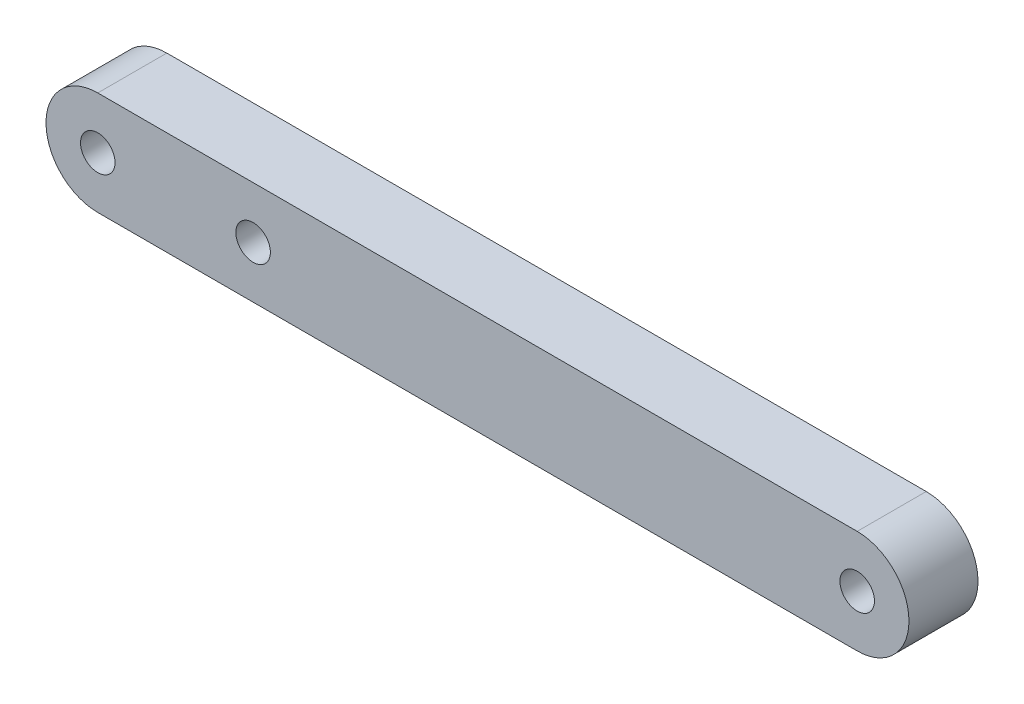
ISO-10303-21;
HEADER;
FILE_DESCRIPTION(('STEP AP214'),'2;1');
FILE_NAME('part.step','',(''),(''),'','','');
FILE_SCHEMA(('AUTOMOTIVE_DESIGN { 1 0 10303 214 1 1 1 1 }'));
ENDSEC;
DATA;
#1=APPLICATION_CONTEXT('core data for automotive mechanical design processes');
#2=APPLICATION_PROTOCOL_DEFINITION('international standard','automotive_design',2000,#1);
#3=PRODUCT_CONTEXT('',#1,'mechanical');
#4=PRODUCT('Part','Part','',(#3));
#5=PRODUCT_RELATED_PRODUCT_CATEGORY('part','',(#4));
#6=PRODUCT_DEFINITION_FORMATION('','',#4);
#7=PRODUCT_DEFINITION_CONTEXT('part definition',#1,'design');
#8=PRODUCT_DEFINITION('design','',#6,#7);
#9=PRODUCT_DEFINITION_SHAPE('','',#8);
#10=(LENGTH_UNIT() NAMED_UNIT(*) SI_UNIT(.MILLI.,.METRE.));
#11=(NAMED_UNIT(*) PLANE_ANGLE_UNIT() SI_UNIT($,.RADIAN.));
#12=(NAMED_UNIT(*) SI_UNIT($,.STERADIAN.) SOLID_ANGLE_UNIT());
#13=UNCERTAINTY_MEASURE_WITH_UNIT(LENGTH_MEASURE(1.E-05),#10,'distance_accuracy_value','');
#14=(GEOMETRIC_REPRESENTATION_CONTEXT(3) GLOBAL_UNCERTAINTY_ASSIGNED_CONTEXT((#13)) GLOBAL_UNIT_ASSIGNED_CONTEXT((#10,
#11,#12)) REPRESENTATION_CONTEXT('',''));
#15=CARTESIAN_POINT('',(0.,0.,0.));
#16=DIRECTION('',(0.,0.,1.));
#17=DIRECTION('',(1.,0.,0.));
#18=AXIS2_PLACEMENT_3D('',#15,#16,#17);
#19=CARTESIAN_POINT('',(0.,0.,10.));
#20=DIRECTION('',(0.,0.,1.));
#21=DIRECTION('',(1.,0.,0.));
#22=AXIS2_PLACEMENT_3D('',#19,#20,#21);
#23=PLANE('',#22);
#24=CARTESIAN_POINT('',(22.5,0.,10.));
#25=DIRECTION('',(0.,0.,1.));
#26=DIRECTION('',(1.,0.,0.));
#27=AXIS2_PLACEMENT_3D('',#24,#25,#26);
#28=CIRCLE('',#27,2.5);
#29=CARTESIAN_POINT('',(25.,0.,10.));
#30=VERTEX_POINT('',#29);
#31=EDGE_CURVE('E115',#30,#30,#28,.T.);
#32=ORIENTED_EDGE('',*,*,#31,.F.);
#33=EDGE_LOOP('',(#32));
#34=FACE_BOUND('',#33,.T.);
#35=CARTESIAN_POINT('',(0.,0.,10.));
#36=DIRECTION('',(0.,0.,1.));
#37=DIRECTION('',(1.,0.,0.));
#38=AXIS2_PLACEMENT_3D('',#35,#36,#37);
#39=CIRCLE('',#38,7.5);
#40=CARTESIAN_POINT('',(0.,7.5,10.));
#41=VERTEX_POINT('',#40);
#42=CARTESIAN_POINT('',(0.,-7.5,10.));
#43=VERTEX_POINT('',#42);
#44=EDGE_CURVE('E85',#41,#43,#39,.T.);
#45=ORIENTED_EDGE('',*,*,#44,.T.);
#46=DIRECTION('',(1.,0.,0.));
#47=VECTOR('',#46,1.);
#48=CARTESIAN_POINT('',(0.,-7.5,10.));
#49=LINE('',#48,#47);
#50=CARTESIAN_POINT('',(110.,-7.5,10.));
#51=VERTEX_POINT('',#50);
#52=EDGE_CURVE('E80',#43,#51,#49,.T.);
#53=ORIENTED_EDGE('',*,*,#52,.T.);
#54=CARTESIAN_POINT('',(110.,0.,10.));
#55=DIRECTION('',(0.,0.,1.));
#56=DIRECTION('',(1.,0.,0.));
#57=AXIS2_PLACEMENT_3D('',#54,#55,#56);
#58=CIRCLE('',#57,7.5);
#59=CARTESIAN_POINT('',(110.,7.5,10.));
#60=VERTEX_POINT('',#59);
#61=EDGE_CURVE('E83',#51,#60,#58,.T.);
#62=ORIENTED_EDGE('',*,*,#61,.T.);
#63=DIRECTION('',(-1.,0.,0.));
#64=VECTOR('',#63,1.);
#65=CARTESIAN_POINT('',(0.,7.5,10.));
#66=LINE('',#65,#64);
#67=EDGE_CURVE('E50',#60,#41,#66,.T.);
#68=ORIENTED_EDGE('',*,*,#67,.T.);
#69=EDGE_LOOP('',(#45,#53,#62,#68));
#70=FACE_BOUND('',#69,.T.);
#71=CARTESIAN_POINT('',(0.,0.,10.));
#72=DIRECTION('',(0.,0.,1.));
#73=DIRECTION('',(1.,0.,0.));
#74=AXIS2_PLACEMENT_3D('',#71,#72,#73);
#75=CIRCLE('',#74,2.5);
#76=CARTESIAN_POINT('',(2.5,0.,10.));
#77=VERTEX_POINT('',#76);
#78=EDGE_CURVE('E100',#77,#77,#75,.T.);
#79=ORIENTED_EDGE('',*,*,#78,.F.);
#80=EDGE_LOOP('',(#79));
#81=FACE_BOUND('',#80,.T.);
#82=CARTESIAN_POINT('',(110.,0.,10.));
#83=DIRECTION('',(0.,0.,1.));
#84=DIRECTION('',(1.,0.,0.));
#85=AXIS2_PLACEMENT_3D('',#82,#83,#84);
#86=CIRCLE('',#85,2.49999999999999);
#87=CARTESIAN_POINT('',(112.5,0.,10.));
#88=VERTEX_POINT('',#87);
#89=EDGE_CURVE('E121',#88,#88,#86,.T.);
#90=ORIENTED_EDGE('',*,*,#89,.F.);
#91=EDGE_LOOP('',(#90));
#92=FACE_BOUND('',#91,.T.);
#93=ADVANCED_FACE('F33',(#34,#70,#81,#92),#23,.T.);
#94=CARTESIAN_POINT('',(0.,0.,0.));
#95=DIRECTION('',(0.,0.,1.));
#96=DIRECTION('',(1.,0.,0.));
#97=AXIS2_PLACEMENT_3D('',#94,#95,#96);
#98=PLANE('',#97);
#99=CARTESIAN_POINT('',(22.5,0.,0.));
#100=DIRECTION('',(0.,0.,1.));
#101=DIRECTION('',(1.,0.,0.));
#102=AXIS2_PLACEMENT_3D('',#99,#100,#101);
#103=CIRCLE('',#102,2.5);
#104=CARTESIAN_POINT('',(25.,0.,0.));
#105=VERTEX_POINT('',#104);
#106=EDGE_CURVE('E118',#105,#105,#103,.T.);
#107=ORIENTED_EDGE('',*,*,#106,.T.);
#108=EDGE_LOOP('',(#107));
#109=FACE_BOUND('',#108,.T.);
#110=CARTESIAN_POINT('',(0.,0.,0.));
#111=DIRECTION('',(0.,0.,1.));
#112=DIRECTION('',(1.,0.,0.));
#113=AXIS2_PLACEMENT_3D('',#110,#111,#112);
#114=CIRCLE('',#113,7.5);
#115=CARTESIAN_POINT('',(0.,7.5,0.));
#116=VERTEX_POINT('',#115);
#117=CARTESIAN_POINT('',(0.,-7.5,0.));
#118=VERTEX_POINT('',#117);
#119=EDGE_CURVE('E97',#116,#118,#114,.T.);
#120=ORIENTED_EDGE('',*,*,#119,.F.);
#121=DIRECTION('',(-1.,0.,0.));
#122=VECTOR('',#121,1.);
#123=CARTESIAN_POINT('',(0.,7.5,0.));
#124=LINE('',#123,#122);
#125=CARTESIAN_POINT('',(110.,7.5,0.));
#126=VERTEX_POINT('',#125);
#127=EDGE_CURVE('E73',#126,#116,#124,.T.);
#128=ORIENTED_EDGE('',*,*,#127,.F.);
#129=CARTESIAN_POINT('',(110.,0.,0.));
#130=DIRECTION('',(0.,0.,1.));
#131=DIRECTION('',(1.,0.,0.));
#132=AXIS2_PLACEMENT_3D('',#129,#130,#131);
#133=CIRCLE('',#132,7.5);
#134=CARTESIAN_POINT('',(110.,-7.5,0.));
#135=VERTEX_POINT('',#134);
#136=EDGE_CURVE('E67',#135,#126,#133,.T.);
#137=ORIENTED_EDGE('',*,*,#136,.F.);
#138=DIRECTION('',(1.,0.,0.));
#139=VECTOR('',#138,1.);
#140=CARTESIAN_POINT('',(0.,-7.5,0.));
#141=LINE('',#140,#139);
#142=EDGE_CURVE('E89',#118,#135,#141,.T.);
#143=ORIENTED_EDGE('',*,*,#142,.F.);
#144=EDGE_LOOP('',(#120,#128,#137,#143));
#145=FACE_BOUND('',#144,.T.);
#146=CARTESIAN_POINT('',(0.,0.,0.));
#147=DIRECTION('',(0.,0.,1.));
#148=DIRECTION('',(1.,0.,0.));
#149=AXIS2_PLACEMENT_3D('',#146,#147,#148);
#150=CIRCLE('',#149,2.5);
#151=CARTESIAN_POINT('',(2.5,0.,0.));
#152=VERTEX_POINT('',#151);
#153=EDGE_CURVE('E112',#152,#152,#150,.T.);
#154=ORIENTED_EDGE('',*,*,#153,.T.);
#155=EDGE_LOOP('',(#154));
#156=FACE_BOUND('',#155,.T.);
#157=CARTESIAN_POINT('',(110.,0.,0.));
#158=DIRECTION('',(0.,0.,1.));
#159=DIRECTION('',(1.,0.,0.));
#160=AXIS2_PLACEMENT_3D('',#157,#158,#159);
#161=CIRCLE('',#160,2.49999999999999);
#162=CARTESIAN_POINT('',(112.5,0.,0.));
#163=VERTEX_POINT('',#162);
#164=EDGE_CURVE('E124',#163,#163,#161,.T.);
#165=ORIENTED_EDGE('',*,*,#164,.T.);
#166=EDGE_LOOP('',(#165));
#167=FACE_BOUND('',#166,.T.);
#168=ADVANCED_FACE('F108',(#109,#145,#156,#167),#98,.F.);
#169=CARTESIAN_POINT('',(0.,0.,10.));
#170=DIRECTION('',(0.,0.,-1.));
#171=DIRECTION('',(-1.,0.,0.));
#172=AXIS2_PLACEMENT_3D('',#169,#170,#171);
#173=CYLINDRICAL_SURFACE('',#172,7.5);
#174=ORIENTED_EDGE('',*,*,#119,.T.);
#175=DIRECTION('',(0.,0.,-1.));
#176=VECTOR('',#175,1.);
#177=CARTESIAN_POINT('',(0.,-7.5,10.));
#178=LINE('',#177,#176);
#179=EDGE_CURVE('E11',#43,#118,#178,.T.);
#180=ORIENTED_EDGE('',*,*,#179,.F.);
#181=ORIENTED_EDGE('',*,*,#44,.F.);
#182=DIRECTION('',(0.,0.,-1.));
#183=VECTOR('',#182,1.);
#184=CARTESIAN_POINT('',(0.,7.5,10.));
#185=LINE('',#184,#183);
#186=EDGE_CURVE('E93',#41,#116,#185,.T.);
#187=ORIENTED_EDGE('',*,*,#186,.T.);
#188=EDGE_LOOP('',(#174,#180,#181,#187));
#189=FACE_BOUND('',#188,.T.);
#190=ADVANCED_FACE('F35',(#189),#173,.T.);
#191=CARTESIAN_POINT('',(0.,-7.5,10.));
#192=DIRECTION('',(0.,1.,0.));
#193=DIRECTION('',(0.,0.,1.));
#194=AXIS2_PLACEMENT_3D('',#191,#192,#193);
#195=PLANE('',#194);
#196=ORIENTED_EDGE('',*,*,#142,.T.);
#197=DIRECTION('',(0.,0.,-1.));
#198=VECTOR('',#197,1.);
#199=CARTESIAN_POINT('',(110.,-7.5,10.));
#200=LINE('',#199,#198);
#201=EDGE_CURVE('E42',#51,#135,#200,.T.);
#202=ORIENTED_EDGE('',*,*,#201,.F.);
#203=ORIENTED_EDGE('',*,*,#52,.F.);
#204=ORIENTED_EDGE('',*,*,#179,.T.);
#205=EDGE_LOOP('',(#196,#202,#203,#204));
#206=FACE_BOUND('',#205,.T.);
#207=ADVANCED_FACE('F88',(#206),#195,.F.);
#208=CARTESIAN_POINT('',(110.,0.,10.));
#209=DIRECTION('',(0.,0.,-1.));
#210=DIRECTION('',(-1.,0.,0.));
#211=AXIS2_PLACEMENT_3D('',#208,#209,#210);
#212=CYLINDRICAL_SURFACE('',#211,7.5);
#213=ORIENTED_EDGE('',*,*,#136,.T.);
#214=DIRECTION('',(0.,0.,-1.));
#215=VECTOR('',#214,1.);
#216=CARTESIAN_POINT('',(110.,7.5,10.));
#217=LINE('',#216,#215);
#218=EDGE_CURVE('E90',#60,#126,#217,.T.);
#219=ORIENTED_EDGE('',*,*,#218,.F.);
#220=ORIENTED_EDGE('',*,*,#61,.F.);
#221=ORIENTED_EDGE('',*,*,#201,.T.);
#222=EDGE_LOOP('',(#213,#219,#220,#221));
#223=FACE_BOUND('',#222,.T.);
#224=ADVANCED_FACE('F91',(#223),#212,.T.);
#225=CARTESIAN_POINT('',(0.,7.5,10.));
#226=DIRECTION('',(0.,-1.,0.));
#227=DIRECTION('',(0.,0.,-1.));
#228=AXIS2_PLACEMENT_3D('',#225,#226,#227);
#229=PLANE('',#228);
#230=ORIENTED_EDGE('',*,*,#127,.T.);
#231=ORIENTED_EDGE('',*,*,#186,.F.);
#232=ORIENTED_EDGE('',*,*,#67,.F.);
#233=ORIENTED_EDGE('',*,*,#218,.T.);
#234=EDGE_LOOP('',(#230,#231,#232,#233));
#235=FACE_BOUND('',#234,.T.);
#236=ADVANCED_FACE('F105',(#235),#229,.F.);
#237=CARTESIAN_POINT('',(0.,0.,10.));
#238=DIRECTION('',(0.,0.,-1.));
#239=DIRECTION('',(-1.,0.,0.));
#240=AXIS2_PLACEMENT_3D('',#237,#238,#239);
#241=CYLINDRICAL_SURFACE('',#240,2.5);
#242=ORIENTED_EDGE('',*,*,#78,.T.);
#243=EDGE_LOOP('',(#242));
#244=FACE_BOUND('',#243,.T.);
#245=ORIENTED_EDGE('',*,*,#153,.F.);
#246=EDGE_LOOP('',(#245));
#247=FACE_BOUND('',#246,.T.);
#248=ADVANCED_FACE('F143',(#244,#247),#241,.F.);
#249=CARTESIAN_POINT('',(22.5,0.,10.));
#250=DIRECTION('',(0.,0.,-1.));
#251=DIRECTION('',(-1.,0.,0.));
#252=AXIS2_PLACEMENT_3D('',#249,#250,#251);
#253=CYLINDRICAL_SURFACE('',#252,2.5);
#254=ORIENTED_EDGE('',*,*,#31,.T.);
#255=EDGE_LOOP('',(#254));
#256=FACE_BOUND('',#255,.T.);
#257=ORIENTED_EDGE('',*,*,#106,.F.);
#258=EDGE_LOOP('',(#257));
#259=FACE_BOUND('',#258,.T.);
#260=ADVANCED_FACE('F189',(#256,#259),#253,.F.);
#261=CARTESIAN_POINT('',(110.,0.,10.));
#262=DIRECTION('',(0.,0.,-1.));
#263=DIRECTION('',(-1.,0.,0.));
#264=AXIS2_PLACEMENT_3D('',#261,#262,#263);
#265=CYLINDRICAL_SURFACE('',#264,2.49999999999999);
#266=ORIENTED_EDGE('',*,*,#89,.T.);
#267=EDGE_LOOP('',(#266));
#268=FACE_BOUND('',#267,.T.);
#269=ORIENTED_EDGE('',*,*,#164,.F.);
#270=EDGE_LOOP('',(#269));
#271=FACE_BOUND('',#270,.T.);
#272=ADVANCED_FACE('F130',(#268,#271),#265,.F.);
#273=CLOSED_SHELL('',(#93,#168,#190,#207,#224,#236,#248,#260,#272));
#274=MANIFOLD_SOLID_BREP('B2',#273);
#275=ADVANCED_BREP_SHAPE_REPRESENTATION('',(#18,#274),#14);
#276=SHAPE_DEFINITION_REPRESENTATION(#9,#275);
ENDSEC;
END-ISO-10303-21;
